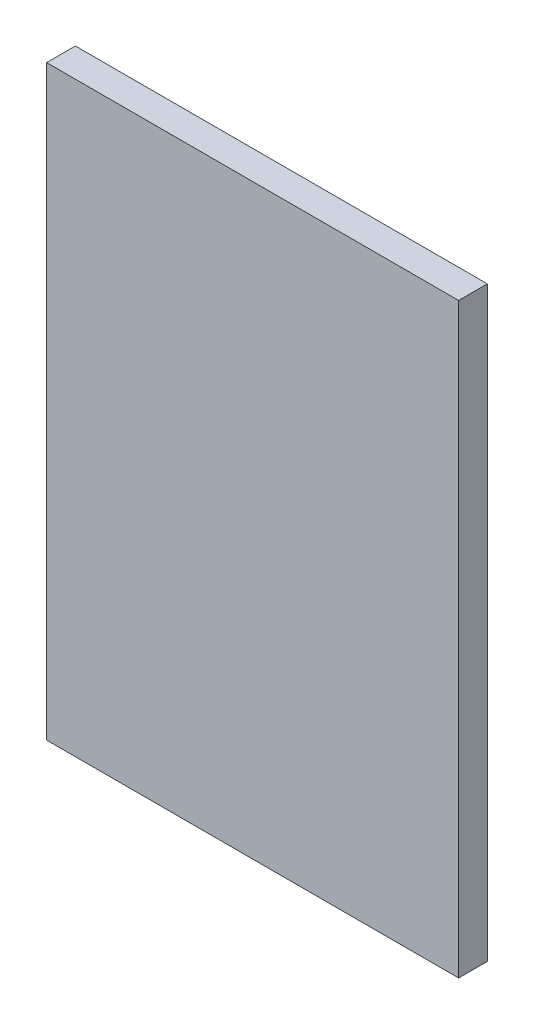
ISO-10303-21;
HEADER;
FILE_DESCRIPTION(('STEP AP214'),'2;1');
FILE_NAME('part.step','',(''),(''),'','','');
FILE_SCHEMA(('AUTOMOTIVE_DESIGN { 1 0 10303 214 1 1 1 1 }'));
ENDSEC;
DATA;
#1=APPLICATION_CONTEXT('core data for automotive mechanical design processes');
#2=APPLICATION_PROTOCOL_DEFINITION('international standard','automotive_design',2000,#1);
#3=PRODUCT_CONTEXT('',#1,'mechanical');
#4=PRODUCT('Part','Part','',(#3));
#5=PRODUCT_RELATED_PRODUCT_CATEGORY('part','',(#4));
#6=PRODUCT_DEFINITION_FORMATION('','',#4);
#7=PRODUCT_DEFINITION_CONTEXT('part definition',#1,'design');
#8=PRODUCT_DEFINITION('design','',#6,#7);
#9=PRODUCT_DEFINITION_SHAPE('','',#8);
#10=(LENGTH_UNIT() NAMED_UNIT(*) SI_UNIT(.MILLI.,.METRE.));
#11=(NAMED_UNIT(*) PLANE_ANGLE_UNIT() SI_UNIT($,.RADIAN.));
#12=(NAMED_UNIT(*) SI_UNIT($,.STERADIAN.) SOLID_ANGLE_UNIT());
#13=UNCERTAINTY_MEASURE_WITH_UNIT(LENGTH_MEASURE(1.E-05),#10,'distance_accuracy_value','');
#14=(GEOMETRIC_REPRESENTATION_CONTEXT(3) GLOBAL_UNCERTAINTY_ASSIGNED_CONTEXT((#13)) GLOBAL_UNIT_ASSIGNED_CONTEXT((#10,
#11,#12)) REPRESENTATION_CONTEXT('',''));
#15=CARTESIAN_POINT('',(0.,0.,0.));
#16=DIRECTION('',(0.,0.,1.));
#17=DIRECTION('',(1.,0.,0.));
#18=AXIS2_PLACEMENT_3D('',#15,#16,#17);
#19=CARTESIAN_POINT('',(148.43125,222.634848484848,9.525));
#20=DIRECTION('',(1.,0.,0.));
#21=DIRECTION('',(0.,1.,0.));
#22=AXIS2_PLACEMENT_3D('',#19,#20,#21);
#23=PLANE('',#22);
#24=DIRECTION('',(0.,-1.,0.));
#25=VECTOR('',#24,1.);
#26=CARTESIAN_POINT('',(148.43125,222.634848484848,0.));
#27=LINE('',#26,#25);
#28=CARTESIAN_POINT('',(148.43125,222.634848484848,0.));
#29=VERTEX_POINT('',#28);
#30=CARTESIAN_POINT('',(148.43125,28.1901515151514,0.));
#31=VERTEX_POINT('',#30);
#32=EDGE_CURVE('E98',#29,#31,#27,.T.);
#33=ORIENTED_EDGE('',*,*,#32,.F.);
#34=DIRECTION('',(0.,0.,-1.));
#35=VECTOR('',#34,1.);
#36=CARTESIAN_POINT('',(148.43125,222.634848484848,9.525));
#37=LINE('',#36,#35);
#38=CARTESIAN_POINT('',(148.43125,222.634848484848,9.525));
#39=VERTEX_POINT('',#38);
#40=EDGE_CURVE('E11',#39,#29,#37,.T.);
#41=ORIENTED_EDGE('',*,*,#40,.F.);
#42=DIRECTION('',(0.,-1.,0.));
#43=VECTOR('',#42,1.);
#44=CARTESIAN_POINT('',(148.43125,222.634848484848,9.525));
#45=LINE('',#44,#43);
#46=CARTESIAN_POINT('',(148.43125,28.1901515151514,9.525));
#47=VERTEX_POINT('',#46);
#48=EDGE_CURVE('E92',#39,#47,#45,.T.);
#49=ORIENTED_EDGE('',*,*,#48,.T.);
#50=DIRECTION('',(0.,0.,-1.));
#51=VECTOR('',#50,1.);
#52=CARTESIAN_POINT('',(148.43125,28.1901515151514,9.525));
#53=LINE('',#52,#51);
#54=EDGE_CURVE('E37',#47,#31,#53,.T.);
#55=ORIENTED_EDGE('',*,*,#54,.T.);
#56=EDGE_LOOP('',(#33,#41,#49,#55));
#57=FACE_BOUND('',#56,.T.);
#58=ADVANCED_FACE('F34',(#57),#23,.T.);
#59=CARTESIAN_POINT('',(148.43125,222.634848484848,9.525));
#60=DIRECTION('',(0.,1.,0.));
#61=DIRECTION('',(0.,0.,1.));
#62=AXIS2_PLACEMENT_3D('',#59,#60,#61);
#63=PLANE('',#62);
#64=DIRECTION('',(1.,0.,0.));
#65=VECTOR('',#64,1.);
#66=CARTESIAN_POINT('',(148.43125,222.634848484848,0.));
#67=LINE('',#66,#65);
#68=CARTESIAN_POINT('',(11.90625,222.634848484848,0.));
#69=VERTEX_POINT('',#68);
#70=EDGE_CURVE('E94',#69,#29,#67,.T.);
#71=ORIENTED_EDGE('',*,*,#70,.F.);
#72=DIRECTION('',(0.,0.,-1.));
#73=VECTOR('',#72,1.);
#74=CARTESIAN_POINT('',(11.90625,222.634848484848,9.525));
#75=LINE('',#74,#73);
#76=CARTESIAN_POINT('',(11.90625,222.634848484848,9.525));
#77=VERTEX_POINT('',#76);
#78=EDGE_CURVE('E43',#77,#69,#75,.T.);
#79=ORIENTED_EDGE('',*,*,#78,.F.);
#80=DIRECTION('',(1.,0.,0.));
#81=VECTOR('',#80,1.);
#82=CARTESIAN_POINT('',(148.43125,222.634848484848,9.525));
#83=LINE('',#82,#81);
#84=EDGE_CURVE('E89',#77,#39,#83,.T.);
#85=ORIENTED_EDGE('',*,*,#84,.T.);
#86=ORIENTED_EDGE('',*,*,#40,.T.);
#87=EDGE_LOOP('',(#71,#79,#85,#86));
#88=FACE_BOUND('',#87,.T.);
#89=ADVANCED_FACE('F108',(#88),#63,.T.);
#90=CARTESIAN_POINT('',(11.90625,222.634848484848,9.525));
#91=DIRECTION('',(-1.,0.,0.));
#92=DIRECTION('',(0.,-1.,0.));
#93=AXIS2_PLACEMENT_3D('',#90,#91,#92);
#94=PLANE('',#93);
#95=DIRECTION('',(0.,1.,0.));
#96=VECTOR('',#95,1.);
#97=CARTESIAN_POINT('',(11.90625,222.634848484848,0.));
#98=LINE('',#97,#96);
#99=CARTESIAN_POINT('',(11.90625,28.1901515151514,0.));
#100=VERTEX_POINT('',#99);
#101=EDGE_CURVE('E84',#100,#69,#98,.T.);
#102=ORIENTED_EDGE('',*,*,#101,.F.);
#103=DIRECTION('',(0.,0.,-1.));
#104=VECTOR('',#103,1.);
#105=CARTESIAN_POINT('',(11.90625,28.1901515151514,9.525));
#106=LINE('',#105,#104);
#107=CARTESIAN_POINT('',(11.90625,28.1901515151514,9.525));
#108=VERTEX_POINT('',#107);
#109=EDGE_CURVE('E79',#108,#100,#106,.T.);
#110=ORIENTED_EDGE('',*,*,#109,.F.);
#111=DIRECTION('',(0.,1.,0.));
#112=VECTOR('',#111,1.);
#113=CARTESIAN_POINT('',(11.90625,222.634848484848,9.525));
#114=LINE('',#113,#112);
#115=EDGE_CURVE('E82',#108,#77,#114,.T.);
#116=ORIENTED_EDGE('',*,*,#115,.T.);
#117=ORIENTED_EDGE('',*,*,#78,.T.);
#118=EDGE_LOOP('',(#102,#110,#116,#117));
#119=FACE_BOUND('',#118,.T.);
#120=ADVANCED_FACE('F81',(#119),#94,.T.);
#121=CARTESIAN_POINT('',(148.43125,28.1901515151514,9.525));
#122=DIRECTION('',(0.,-1.,0.));
#123=DIRECTION('',(1.,0.,0.));
#124=AXIS2_PLACEMENT_3D('',#121,#122,#123);
#125=PLANE('',#124);
#126=DIRECTION('',(-1.,0.,0.));
#127=VECTOR('',#126,1.);
#128=CARTESIAN_POINT('',(148.43125,28.1901515151514,0.));
#129=LINE('',#128,#127);
#130=EDGE_CURVE('E101',#31,#100,#129,.T.);
#131=ORIENTED_EDGE('',*,*,#130,.F.);
#132=ORIENTED_EDGE('',*,*,#54,.F.);
#133=DIRECTION('',(-1.,0.,0.));
#134=VECTOR('',#133,1.);
#135=CARTESIAN_POINT('',(148.43125,28.1901515151514,9.525));
#136=LINE('',#135,#134);
#137=EDGE_CURVE('E88',#47,#108,#136,.T.);
#138=ORIENTED_EDGE('',*,*,#137,.T.);
#139=ORIENTED_EDGE('',*,*,#109,.T.);
#140=EDGE_LOOP('',(#131,#132,#138,#139));
#141=FACE_BOUND('',#140,.T.);
#142=ADVANCED_FACE('F91',(#141),#125,.T.);
#143=CARTESIAN_POINT('',(0.,0.,9.525));
#144=DIRECTION('',(0.,0.,-1.));
#145=DIRECTION('',(-1.,0.,0.));
#146=AXIS2_PLACEMENT_3D('',#143,#144,#145);
#147=PLANE('',#146);
#148=ORIENTED_EDGE('',*,*,#48,.F.);
#149=ORIENTED_EDGE('',*,*,#84,.F.);
#150=ORIENTED_EDGE('',*,*,#115,.F.);
#151=ORIENTED_EDGE('',*,*,#137,.F.);
#152=EDGE_LOOP('',(#148,#149,#150,#151));
#153=FACE_BOUND('',#152,.T.);
#154=ADVANCED_FACE('F87',(#153),#147,.F.);
#155=CARTESIAN_POINT('',(0.,0.,0.));
#156=DIRECTION('',(0.,0.,-1.));
#157=DIRECTION('',(-1.,0.,0.));
#158=AXIS2_PLACEMENT_3D('',#155,#156,#157);
#159=PLANE('',#158);
#160=ORIENTED_EDGE('',*,*,#32,.T.);
#161=ORIENTED_EDGE('',*,*,#130,.T.);
#162=ORIENTED_EDGE('',*,*,#101,.T.);
#163=ORIENTED_EDGE('',*,*,#70,.T.);
#164=EDGE_LOOP('',(#160,#161,#162,#163));
#165=FACE_BOUND('',#164,.T.);
#166=ADVANCED_FACE('F107',(#165),#159,.T.);
#167=CLOSED_SHELL('',(#58,#89,#120,#142,#154,#166));
#168=MANIFOLD_SOLID_BREP('B2',#167);
#169=ADVANCED_BREP_SHAPE_REPRESENTATION('',(#18,#168),#14);
#170=SHAPE_DEFINITION_REPRESENTATION(#9,#169);
ENDSEC;
END-ISO-10303-21;
